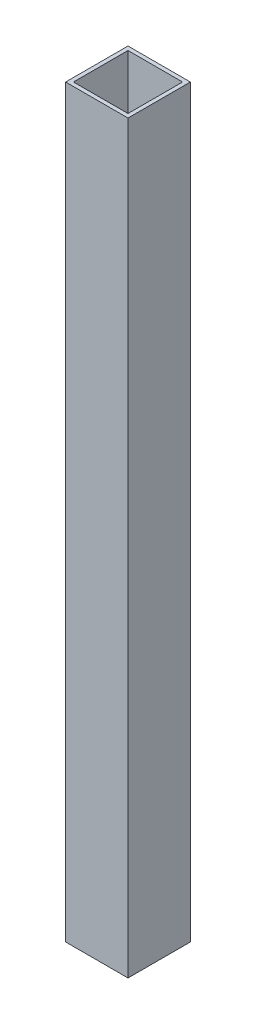
ISO-10303-21;
HEADER;
FILE_DESCRIPTION(('STEP AP214'),'2;1');
FILE_NAME('part.step','',(''),(''),'','','');
FILE_SCHEMA(('AUTOMOTIVE_DESIGN { 1 0 10303 214 1 1 1 1 }'));
ENDSEC;
DATA;
#1=APPLICATION_CONTEXT('core data for automotive mechanical design processes');
#2=APPLICATION_PROTOCOL_DEFINITION('international standard','automotive_design',2000,#1);
#3=PRODUCT_CONTEXT('',#1,'mechanical');
#4=PRODUCT('Part','Part','',(#3));
#5=PRODUCT_RELATED_PRODUCT_CATEGORY('part','',(#4));
#6=PRODUCT_DEFINITION_FORMATION('','',#4);
#7=PRODUCT_DEFINITION_CONTEXT('part definition',#1,'design');
#8=PRODUCT_DEFINITION('design','',#6,#7);
#9=PRODUCT_DEFINITION_SHAPE('','',#8);
#10=(LENGTH_UNIT() NAMED_UNIT(*) SI_UNIT(.MILLI.,.METRE.));
#11=(NAMED_UNIT(*) PLANE_ANGLE_UNIT() SI_UNIT($,.RADIAN.));
#12=(NAMED_UNIT(*) SI_UNIT($,.STERADIAN.) SOLID_ANGLE_UNIT());
#13=UNCERTAINTY_MEASURE_WITH_UNIT(LENGTH_MEASURE(1.E-05),#10,'distance_accuracy_value','');
#14=(GEOMETRIC_REPRESENTATION_CONTEXT(3) GLOBAL_UNCERTAINTY_ASSIGNED_CONTEXT((#13)) GLOBAL_UNIT_ASSIGNED_CONTEXT((#10,
#11,#12)) REPRESENTATION_CONTEXT('',''));
#15=CARTESIAN_POINT('',(0.,0.,0.));
#16=DIRECTION('',(0.,0.,1.));
#17=DIRECTION('',(1.,0.,0.));
#18=AXIS2_PLACEMENT_3D('',#15,#16,#17);
#19=CARTESIAN_POINT('',(0.,910.,0.));
#20=DIRECTION('',(0.,1.,0.));
#21=DIRECTION('',(0.,0.,1.));
#22=AXIS2_PLACEMENT_3D('',#19,#20,#21);
#23=PLANE('',#22);
#24=DIRECTION('',(0.,0.,1.));
#25=VECTOR('',#24,1.);
#26=CARTESIAN_POINT('',(0.,910.,0.));
#27=LINE('',#26,#25);
#28=CARTESIAN_POINT('',(0.,910.,0.));
#29=VERTEX_POINT('',#28);
#30=CARTESIAN_POINT('',(0.,910.,76.2));
#31=VERTEX_POINT('',#30);
#32=EDGE_CURVE('E135',#29,#31,#27,.T.);
#33=ORIENTED_EDGE('',*,*,#32,.T.);
#34=DIRECTION('',(1.,0.,0.));
#35=VECTOR('',#34,1.);
#36=CARTESIAN_POINT('',(0.,910.,76.2));
#37=LINE('',#36,#35);
#38=CARTESIAN_POINT('',(76.2,910.,76.2));
#39=VERTEX_POINT('',#38);
#40=EDGE_CURVE('E138',#31,#39,#37,.T.);
#41=ORIENTED_EDGE('',*,*,#40,.T.);
#42=DIRECTION('',(0.,0.,-1.));
#43=VECTOR('',#42,1.);
#44=CARTESIAN_POINT('',(76.2,910.,0.));
#45=LINE('',#44,#43);
#46=CARTESIAN_POINT('',(76.2,910.,0.));
#47=VERTEX_POINT('',#46);
#48=EDGE_CURVE('E141',#39,#47,#45,.T.);
#49=ORIENTED_EDGE('',*,*,#48,.T.);
#50=DIRECTION('',(-1.,0.,0.));
#51=VECTOR('',#50,1.);
#52=CARTESIAN_POINT('',(0.,910.,0.));
#53=LINE('',#52,#51);
#54=EDGE_CURVE('E143',#47,#29,#53,.T.);
#55=ORIENTED_EDGE('',*,*,#54,.T.);
#56=EDGE_LOOP('',(#33,#41,#49,#55));
#57=FACE_BOUND('',#56,.T.);
#58=DIRECTION('',(1.,0.,0.));
#59=VECTOR('',#58,1.);
#60=CARTESIAN_POINT('',(4.7625,910.,71.4375));
#61=LINE('',#60,#59);
#62=CARTESIAN_POINT('',(4.7625,910.,71.4375));
#63=VERTEX_POINT('',#62);
#64=CARTESIAN_POINT('',(71.4375,910.,71.4375));
#65=VERTEX_POINT('',#64);
#66=EDGE_CURVE('E107',#63,#65,#61,.T.);
#67=ORIENTED_EDGE('',*,*,#66,.F.);
#68=DIRECTION('',(0.,0.,1.));
#69=VECTOR('',#68,1.);
#70=CARTESIAN_POINT('',(4.7625,910.,4.7625));
#71=LINE('',#70,#69);
#72=CARTESIAN_POINT('',(4.7625,910.,4.7625));
#73=VERTEX_POINT('',#72);
#74=EDGE_CURVE('E99',#73,#63,#71,.T.);
#75=ORIENTED_EDGE('',*,*,#74,.F.);
#76=DIRECTION('',(-1.,0.,0.));
#77=VECTOR('',#76,1.);
#78=CARTESIAN_POINT('',(4.7625,910.,4.7625));
#79=LINE('',#78,#77);
#80=CARTESIAN_POINT('',(71.4375,910.,4.7625));
#81=VERTEX_POINT('',#80);
#82=EDGE_CURVE('E121',#81,#73,#79,.T.);
#83=ORIENTED_EDGE('',*,*,#82,.F.);
#84=DIRECTION('',(0.,0.,-1.));
#85=VECTOR('',#84,1.);
#86=CARTESIAN_POINT('',(71.4375,910.,4.7625));
#87=LINE('',#86,#85);
#88=EDGE_CURVE('E119',#65,#81,#87,.T.);
#89=ORIENTED_EDGE('',*,*,#88,.F.);
#90=EDGE_LOOP('',(#67,#75,#83,#89));
#91=FACE_BOUND('',#90,.T.);
#92=ADVANCED_FACE('F34',(#57,#91),#23,.T.);
#93=CARTESIAN_POINT('',(0.,0.,0.));
#94=DIRECTION('',(0.,1.,0.));
#95=DIRECTION('',(0.,0.,1.));
#96=AXIS2_PLACEMENT_3D('',#93,#94,#95);
#97=PLANE('',#96);
#98=DIRECTION('',(0.,0.,1.));
#99=VECTOR('',#98,1.);
#100=CARTESIAN_POINT('',(0.,0.,0.));
#101=LINE('',#100,#99);
#102=CARTESIAN_POINT('',(0.,0.,0.));
#103=VERTEX_POINT('',#102);
#104=CARTESIAN_POINT('',(0.,0.,76.2));
#105=VERTEX_POINT('',#104);
#106=EDGE_CURVE('E115',#103,#105,#101,.T.);
#107=ORIENTED_EDGE('',*,*,#106,.F.);
#108=DIRECTION('',(-1.,0.,0.));
#109=VECTOR('',#108,1.);
#110=CARTESIAN_POINT('',(0.,0.,0.));
#111=LINE('',#110,#109);
#112=CARTESIAN_POINT('',(76.2,0.,0.));
#113=VERTEX_POINT('',#112);
#114=EDGE_CURVE('E139',#113,#103,#111,.T.);
#115=ORIENTED_EDGE('',*,*,#114,.F.);
#116=DIRECTION('',(0.,0.,-1.));
#117=VECTOR('',#116,1.);
#118=CARTESIAN_POINT('',(76.2,0.,0.));
#119=LINE('',#118,#117);
#120=CARTESIAN_POINT('',(76.2,0.,76.2));
#121=VERTEX_POINT('',#120);
#122=EDGE_CURVE('E150',#121,#113,#119,.T.);
#123=ORIENTED_EDGE('',*,*,#122,.F.);
#124=DIRECTION('',(1.,0.,0.));
#125=VECTOR('',#124,1.);
#126=CARTESIAN_POINT('',(0.,0.,76.2));
#127=LINE('',#126,#125);
#128=EDGE_CURVE('E148',#105,#121,#127,.T.);
#129=ORIENTED_EDGE('',*,*,#128,.F.);
#130=EDGE_LOOP('',(#107,#115,#123,#129));
#131=FACE_BOUND('',#130,.T.);
#132=DIRECTION('',(0.,0.,1.));
#133=VECTOR('',#132,1.);
#134=CARTESIAN_POINT('',(4.7625,0.,4.7625));
#135=LINE('',#134,#133);
#136=CARTESIAN_POINT('',(4.7625,0.,4.7625));
#137=VERTEX_POINT('',#136);
#138=CARTESIAN_POINT('',(4.7625,0.,71.4375));
#139=VERTEX_POINT('',#138);
#140=EDGE_CURVE('E57',#137,#139,#135,.T.);
#141=ORIENTED_EDGE('',*,*,#140,.T.);
#142=DIRECTION('',(1.,0.,0.));
#143=VECTOR('',#142,1.);
#144=CARTESIAN_POINT('',(4.7625,0.,71.4375));
#145=LINE('',#144,#143);
#146=CARTESIAN_POINT('',(71.4375,0.,71.4375));
#147=VERTEX_POINT('',#146);
#148=EDGE_CURVE('E114',#139,#147,#145,.T.);
#149=ORIENTED_EDGE('',*,*,#148,.T.);
#150=DIRECTION('',(0.,0.,-1.));
#151=VECTOR('',#150,1.);
#152=CARTESIAN_POINT('',(71.4375,0.,4.7625));
#153=LINE('',#152,#151);
#154=CARTESIAN_POINT('',(71.4375,0.,4.7625));
#155=VERTEX_POINT('',#154);
#156=EDGE_CURVE('E127',#147,#155,#153,.T.);
#157=ORIENTED_EDGE('',*,*,#156,.T.);
#158=DIRECTION('',(-1.,0.,0.));
#159=VECTOR('',#158,1.);
#160=CARTESIAN_POINT('',(4.7625,0.,4.7625));
#161=LINE('',#160,#159);
#162=EDGE_CURVE('E108',#155,#137,#161,.T.);
#163=ORIENTED_EDGE('',*,*,#162,.T.);
#164=EDGE_LOOP('',(#141,#149,#157,#163));
#165=FACE_BOUND('',#164,.T.);
#166=ADVANCED_FACE('F168',(#131,#165),#97,.F.);
#167=CARTESIAN_POINT('',(0.,910.,0.));
#168=DIRECTION('',(1.,0.,0.));
#169=DIRECTION('',(0.,0.,-1.));
#170=AXIS2_PLACEMENT_3D('',#167,#168,#169);
#171=PLANE('',#170);
#172=ORIENTED_EDGE('',*,*,#106,.T.);
#173=DIRECTION('',(0.,-1.,0.));
#174=VECTOR('',#173,1.);
#175=CARTESIAN_POINT('',(0.,910.,76.2));
#176=LINE('',#175,#174);
#177=EDGE_CURVE('E11',#31,#105,#176,.T.);
#178=ORIENTED_EDGE('',*,*,#177,.F.);
#179=ORIENTED_EDGE('',*,*,#32,.F.);
#180=DIRECTION('',(0.,-1.,0.));
#181=VECTOR('',#180,1.);
#182=CARTESIAN_POINT('',(0.,910.,0.));
#183=LINE('',#182,#181);
#184=EDGE_CURVE('E145',#29,#103,#183,.T.);
#185=ORIENTED_EDGE('',*,*,#184,.T.);
#186=EDGE_LOOP('',(#172,#178,#179,#185));
#187=FACE_BOUND('',#186,.T.);
#188=ADVANCED_FACE('F36',(#187),#171,.F.);
#189=CARTESIAN_POINT('',(0.,910.,76.2));
#190=DIRECTION('',(0.,0.,-1.));
#191=DIRECTION('',(-1.,0.,0.));
#192=AXIS2_PLACEMENT_3D('',#189,#190,#191);
#193=PLANE('',#192);
#194=ORIENTED_EDGE('',*,*,#128,.T.);
#195=DIRECTION('',(0.,-1.,0.));
#196=VECTOR('',#195,1.);
#197=CARTESIAN_POINT('',(76.2,910.,76.2));
#198=LINE('',#197,#196);
#199=EDGE_CURVE('E42',#39,#121,#198,.T.);
#200=ORIENTED_EDGE('',*,*,#199,.F.);
#201=ORIENTED_EDGE('',*,*,#40,.F.);
#202=ORIENTED_EDGE('',*,*,#177,.T.);
#203=EDGE_LOOP('',(#194,#200,#201,#202));
#204=FACE_BOUND('',#203,.T.);
#205=ADVANCED_FACE('F178',(#204),#193,.F.);
#206=CARTESIAN_POINT('',(76.2,910.,0.));
#207=DIRECTION('',(-1.,0.,0.));
#208=DIRECTION('',(0.,0.,1.));
#209=AXIS2_PLACEMENT_3D('',#206,#207,#208);
#210=PLANE('',#209);
#211=ORIENTED_EDGE('',*,*,#122,.T.);
#212=DIRECTION('',(0.,-1.,0.));
#213=VECTOR('',#212,1.);
#214=CARTESIAN_POINT('',(76.2,910.,0.));
#215=LINE('',#214,#213);
#216=EDGE_CURVE('E155',#47,#113,#215,.T.);
#217=ORIENTED_EDGE('',*,*,#216,.F.);
#218=ORIENTED_EDGE('',*,*,#48,.F.);
#219=ORIENTED_EDGE('',*,*,#199,.T.);
#220=EDGE_LOOP('',(#211,#217,#218,#219));
#221=FACE_BOUND('',#220,.T.);
#222=ADVANCED_FACE('F162',(#221),#210,.F.);
#223=CARTESIAN_POINT('',(0.,910.,0.));
#224=DIRECTION('',(0.,0.,1.));
#225=DIRECTION('',(1.,0.,0.));
#226=AXIS2_PLACEMENT_3D('',#223,#224,#225);
#227=PLANE('',#226);
#228=ORIENTED_EDGE('',*,*,#114,.T.);
#229=ORIENTED_EDGE('',*,*,#184,.F.);
#230=ORIENTED_EDGE('',*,*,#54,.F.);
#231=ORIENTED_EDGE('',*,*,#216,.T.);
#232=EDGE_LOOP('',(#228,#229,#230,#231));
#233=FACE_BOUND('',#232,.T.);
#234=ADVANCED_FACE('F172',(#233),#227,.F.);
#235=CARTESIAN_POINT('',(4.7625,910.,4.7625));
#236=DIRECTION('',(1.,0.,0.));
#237=DIRECTION('',(0.,0.,-1.));
#238=AXIS2_PLACEMENT_3D('',#235,#236,#237);
#239=PLANE('',#238);
#240=ORIENTED_EDGE('',*,*,#140,.F.);
#241=DIRECTION('',(0.,-1.,0.));
#242=VECTOR('',#241,1.);
#243=CARTESIAN_POINT('',(4.7625,910.,4.7625));
#244=LINE('',#243,#242);
#245=EDGE_CURVE('E103',#73,#137,#244,.T.);
#246=ORIENTED_EDGE('',*,*,#245,.F.);
#247=ORIENTED_EDGE('',*,*,#74,.T.);
#248=DIRECTION('',(0.,-1.,0.));
#249=VECTOR('',#248,1.);
#250=CARTESIAN_POINT('',(4.7625,910.,71.4375));
#251=LINE('',#250,#249);
#252=EDGE_CURVE('E102',#63,#139,#251,.T.);
#253=ORIENTED_EDGE('',*,*,#252,.T.);
#254=EDGE_LOOP('',(#240,#246,#247,#253));
#255=FACE_BOUND('',#254,.T.);
#256=ADVANCED_FACE('F101',(#255),#239,.T.);
#257=CARTESIAN_POINT('',(4.7625,910.,71.4375));
#258=DIRECTION('',(0.,0.,-1.));
#259=DIRECTION('',(-1.,0.,0.));
#260=AXIS2_PLACEMENT_3D('',#257,#258,#259);
#261=PLANE('',#260);
#262=ORIENTED_EDGE('',*,*,#148,.F.);
#263=ORIENTED_EDGE('',*,*,#252,.F.);
#264=ORIENTED_EDGE('',*,*,#66,.T.);
#265=DIRECTION('',(0.,-1.,0.));
#266=VECTOR('',#265,1.);
#267=CARTESIAN_POINT('',(71.4375,910.,71.4375));
#268=LINE('',#267,#266);
#269=EDGE_CURVE('E116',#65,#147,#268,.T.);
#270=ORIENTED_EDGE('',*,*,#269,.T.);
#271=EDGE_LOOP('',(#262,#263,#264,#270));
#272=FACE_BOUND('',#271,.T.);
#273=ADVANCED_FACE('F111',(#272),#261,.T.);
#274=CARTESIAN_POINT('',(71.4375,910.,4.7625));
#275=DIRECTION('',(-1.,0.,0.));
#276=DIRECTION('',(0.,0.,1.));
#277=AXIS2_PLACEMENT_3D('',#274,#275,#276);
#278=PLANE('',#277);
#279=ORIENTED_EDGE('',*,*,#156,.F.);
#280=ORIENTED_EDGE('',*,*,#269,.F.);
#281=ORIENTED_EDGE('',*,*,#88,.T.);
#282=DIRECTION('',(0.,-1.,0.));
#283=VECTOR('',#282,1.);
#284=CARTESIAN_POINT('',(71.4375,910.,4.7625));
#285=LINE('',#284,#283);
#286=EDGE_CURVE('E49',#81,#155,#285,.T.);
#287=ORIENTED_EDGE('',*,*,#286,.T.);
#288=EDGE_LOOP('',(#279,#280,#281,#287));
#289=FACE_BOUND('',#288,.T.);
#290=ADVANCED_FACE('F201',(#289),#278,.T.);
#291=CARTESIAN_POINT('',(4.7625,910.,4.7625));
#292=DIRECTION('',(0.,0.,1.));
#293=DIRECTION('',(1.,0.,0.));
#294=AXIS2_PLACEMENT_3D('',#291,#292,#293);
#295=PLANE('',#294);
#296=ORIENTED_EDGE('',*,*,#162,.F.);
#297=ORIENTED_EDGE('',*,*,#286,.F.);
#298=ORIENTED_EDGE('',*,*,#82,.T.);
#299=ORIENTED_EDGE('',*,*,#245,.T.);
#300=EDGE_LOOP('',(#296,#297,#298,#299));
#301=FACE_BOUND('',#300,.T.);
#302=ADVANCED_FACE('F205',(#301),#295,.T.);
#303=CLOSED_SHELL('',(#92,#166,#188,#205,#222,#234,#256,#273,#290,#302));
#304=MANIFOLD_SOLID_BREP('B2',#303);
#305=ADVANCED_BREP_SHAPE_REPRESENTATION('',(#18,#304),#14);
#306=SHAPE_DEFINITION_REPRESENTATION(#9,#305);
ENDSEC;
END-ISO-10303-21;
